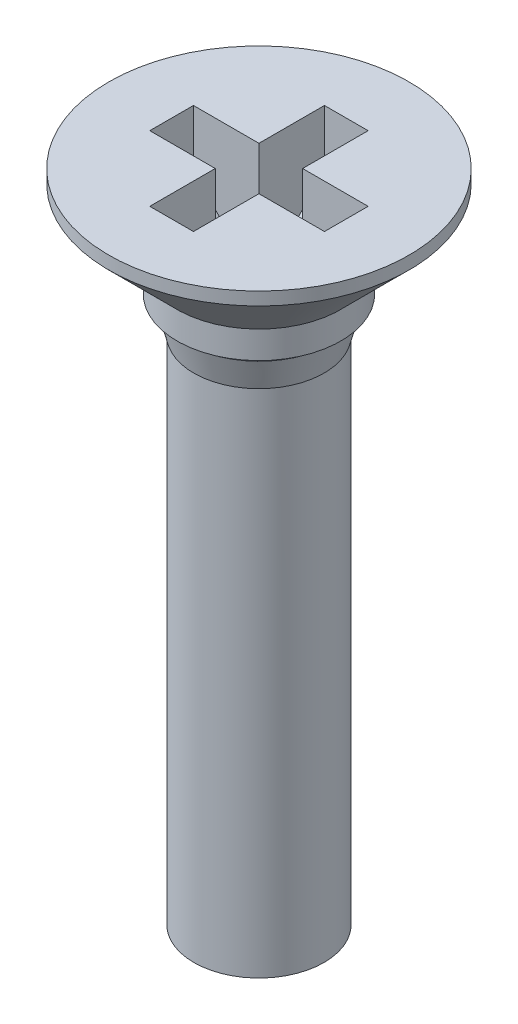
ISO-10303-21;
HEADER;
FILE_DESCRIPTION(('STEP AP214'),'2;1');
FILE_NAME('part.step','',(''),(''),'','','');
FILE_SCHEMA(('AUTOMOTIVE_DESIGN { 1 0 10303 214 1 1 1 1 }'));
ENDSEC;
DATA;
#1=APPLICATION_CONTEXT('core data for automotive mechanical design processes');
#2=APPLICATION_PROTOCOL_DEFINITION('international standard','automotive_design',2000,#1);
#3=PRODUCT_CONTEXT('',#1,'mechanical');
#4=PRODUCT('Part','Part','',(#3));
#5=PRODUCT_RELATED_PRODUCT_CATEGORY('part','',(#4));
#6=PRODUCT_DEFINITION_FORMATION('','',#4);
#7=PRODUCT_DEFINITION_CONTEXT('part definition',#1,'design');
#8=PRODUCT_DEFINITION('design','',#6,#7);
#9=PRODUCT_DEFINITION_SHAPE('','',#8);
#10=(LENGTH_UNIT() NAMED_UNIT(*) SI_UNIT(.MILLI.,.METRE.));
#11=(NAMED_UNIT(*) PLANE_ANGLE_UNIT() SI_UNIT($,.RADIAN.));
#12=(NAMED_UNIT(*) SI_UNIT($,.STERADIAN.) SOLID_ANGLE_UNIT());
#13=UNCERTAINTY_MEASURE_WITH_UNIT(LENGTH_MEASURE(1.E-05),#10,'distance_accuracy_value','');
#14=(GEOMETRIC_REPRESENTATION_CONTEXT(3) GLOBAL_UNCERTAINTY_ASSIGNED_CONTEXT((#13)) GLOBAL_UNIT_ASSIGNED_CONTEXT((#10,
#11,#12)) REPRESENTATION_CONTEXT('',''));
#15=CARTESIAN_POINT('',(0.,0.,0.));
#16=DIRECTION('',(0.,0.,1.));
#17=DIRECTION('',(1.,0.,0.));
#18=AXIS2_PLACEMENT_3D('',#15,#16,#17);
#19=CARTESIAN_POINT('',(0.,-2.65,-0.4));
#20=DIRECTION('',(0.,0.,-1.));
#21=DIRECTION('',(-1.,0.,0.));
#22=AXIS2_PLACEMENT_3D('',#19,#20,#21);
#23=PLANE('',#22);
#24=DIRECTION('',(0.,1.,0.));
#25=VECTOR('',#24,1.);
#26=CARTESIAN_POINT('',(0.4,-2.65,-0.4));
#27=LINE('',#26,#25);
#28=CARTESIAN_POINT('',(0.4,-2.1,-0.4));
#29=VERTEX_POINT('',#28);
#30=CARTESIAN_POINT('',(0.4,0.,-0.4));
#31=VERTEX_POINT('',#30);
#32=EDGE_CURVE('E215',#29,#31,#27,.T.);
#33=ORIENTED_EDGE('',*,*,#32,.F.);
#34=DIRECTION('',(1.,0.,0.));
#35=VECTOR('',#34,1.);
#36=CARTESIAN_POINT('',(-0.550000000000002,-2.1,-0.4));
#37=LINE('',#36,#35);
#38=CARTESIAN_POINT('',(0.550000000000002,-2.1,-0.4));
#39=VERTEX_POINT('',#38);
#40=EDGE_CURVE('E250',#29,#39,#37,.T.);
#41=ORIENTED_EDGE('',*,*,#40,.T.);
#42=DIRECTION('',(0.707106781186546,0.707106781186548,0.));
#43=VECTOR('',#42,1.);
#44=CARTESIAN_POINT('',(1.6,-1.05,-0.4));
#45=LINE('',#44,#43);
#46=CARTESIAN_POINT('',(1.6,-1.05,-0.4));
#47=VERTEX_POINT('',#46);
#48=EDGE_CURVE('E254',#39,#47,#45,.T.);
#49=ORIENTED_EDGE('',*,*,#48,.T.);
#50=DIRECTION('',(0.,1.,0.));
#51=VECTOR('',#50,1.);
#52=CARTESIAN_POINT('',(1.6,0.,-0.4));
#53=LINE('',#52,#51);
#54=CARTESIAN_POINT('',(1.6,0.,-0.4));
#55=VERTEX_POINT('',#54);
#56=EDGE_CURVE('E257',#47,#55,#53,.T.);
#57=ORIENTED_EDGE('',*,*,#56,.T.);
#58=DIRECTION('',(-1.,0.,0.));
#59=VECTOR('',#58,1.);
#60=CARTESIAN_POINT('',(1.6,0.,-0.4));
#61=LINE('',#60,#59);
#62=EDGE_CURVE('E261',#55,#31,#61,.T.);
#63=ORIENTED_EDGE('',*,*,#62,.T.);
#64=EDGE_LOOP('',(#33,#41,#49,#57,#63));
#65=FACE_BOUND('',#64,.T.);
#66=ADVANCED_FACE('F50',(#65),#23,.F.);
#67=CARTESIAN_POINT('',(0.,-2.65,0.4));
#68=DIRECTION('',(0.,0.,-1.));
#69=DIRECTION('',(-1.,0.,0.));
#70=AXIS2_PLACEMENT_3D('',#67,#68,#69);
#71=PLANE('',#70);
#72=DIRECTION('',(1.,0.,0.));
#73=VECTOR('',#72,1.);
#74=CARTESIAN_POINT('',(-0.550000000000002,-2.1,0.4));
#75=LINE('',#74,#73);
#76=CARTESIAN_POINT('',(0.4,-2.1,0.4));
#77=VERTEX_POINT('',#76);
#78=CARTESIAN_POINT('',(0.550000000000002,-2.1,0.4));
#79=VERTEX_POINT('',#78);
#80=EDGE_CURVE('E232',#77,#79,#75,.T.);
#81=ORIENTED_EDGE('',*,*,#80,.F.);
#82=DIRECTION('',(0.,1.,0.));
#83=VECTOR('',#82,1.);
#84=CARTESIAN_POINT('',(0.4,-2.65,0.4));
#85=LINE('',#84,#83);
#86=CARTESIAN_POINT('',(0.4,0.,0.4));
#87=VERTEX_POINT('',#86);
#88=EDGE_CURVE('E58',#77,#87,#85,.T.);
#89=ORIENTED_EDGE('',*,*,#88,.T.);
#90=DIRECTION('',(-1.,0.,0.));
#91=VECTOR('',#90,1.);
#92=CARTESIAN_POINT('',(1.6,0.,0.4));
#93=LINE('',#92,#91);
#94=CARTESIAN_POINT('',(1.6,0.,0.4));
#95=VERTEX_POINT('',#94);
#96=EDGE_CURVE('E241',#95,#87,#93,.T.);
#97=ORIENTED_EDGE('',*,*,#96,.F.);
#98=DIRECTION('',(0.,1.,0.));
#99=VECTOR('',#98,1.);
#100=CARTESIAN_POINT('',(1.6,0.,0.4));
#101=LINE('',#100,#99);
#102=CARTESIAN_POINT('',(1.6,-1.05,0.4));
#103=VERTEX_POINT('',#102);
#104=EDGE_CURVE('E238',#103,#95,#101,.T.);
#105=ORIENTED_EDGE('',*,*,#104,.F.);
#106=DIRECTION('',(0.707106781186546,0.707106781186548,0.));
#107=VECTOR('',#106,1.);
#108=CARTESIAN_POINT('',(1.6,-1.05,0.4));
#109=LINE('',#108,#107);
#110=EDGE_CURVE('E235',#79,#103,#109,.T.);
#111=ORIENTED_EDGE('',*,*,#110,.F.);
#112=EDGE_LOOP('',(#81,#89,#97,#105,#111));
#113=FACE_BOUND('',#112,.T.);
#114=ADVANCED_FACE('F304',(#113),#71,.T.);
#115=CARTESIAN_POINT('',(0.,0.,0.));
#116=DIRECTION('',(0.,-1.,0.));
#117=DIRECTION('',(1.,0.,0.));
#118=AXIS2_PLACEMENT_3D('',#115,#116,#117);
#119=PLANE('',#118);
#120=DIRECTION('',(1.,0.,0.));
#121=VECTOR('',#120,1.);
#122=CARTESIAN_POINT('',(-0.4,0.,1.6));
#123=LINE('',#122,#121);
#124=CARTESIAN_POINT('',(-0.4,0.,1.6));
#125=VERTEX_POINT('',#124);
#126=CARTESIAN_POINT('',(0.4,0.,1.6));
#127=VERTEX_POINT('',#126);
#128=EDGE_CURVE('E216',#125,#127,#123,.T.);
#129=ORIENTED_EDGE('',*,*,#128,.F.);
#130=DIRECTION('',(0.,0.,1.));
#131=VECTOR('',#130,1.);
#132=CARTESIAN_POINT('',(-0.4,0.,-1.6));
#133=LINE('',#132,#131);
#134=CARTESIAN_POINT('',(-0.4,0.,0.399999999999999));
#135=VERTEX_POINT('',#134);
#136=EDGE_CURVE('E209',#135,#125,#133,.T.);
#137=ORIENTED_EDGE('',*,*,#136,.F.);
#138=CARTESIAN_POINT('',(-1.6,0.,0.4));
#139=VERTEX_POINT('',#138);
#140=EDGE_CURVE('E240',#135,#139,#93,.T.);
#141=ORIENTED_EDGE('',*,*,#140,.T.);
#142=DIRECTION('',(0.,0.,1.));
#143=VECTOR('',#142,1.);
#144=CARTESIAN_POINT('',(-1.6,0.,-0.4));
#145=LINE('',#144,#143);
#146=CARTESIAN_POINT('',(-1.6,0.,-0.4));
#147=VERTEX_POINT('',#146);
#148=EDGE_CURVE('E271',#147,#139,#145,.T.);
#149=ORIENTED_EDGE('',*,*,#148,.F.);
#150=CARTESIAN_POINT('',(-0.4,0.,-0.4));
#151=VERTEX_POINT('',#150);
#152=EDGE_CURVE('E260',#151,#147,#61,.T.);
#153=ORIENTED_EDGE('',*,*,#152,.F.);
#154=CARTESIAN_POINT('',(-0.4,0.,-1.6));
#155=VERTEX_POINT('',#154);
#156=EDGE_CURVE('E210',#155,#151,#133,.T.);
#157=ORIENTED_EDGE('',*,*,#156,.F.);
#158=DIRECTION('',(1.,0.,0.));
#159=VECTOR('',#158,1.);
#160=CARTESIAN_POINT('',(-0.4,0.,-1.6));
#161=LINE('',#160,#159);
#162=CARTESIAN_POINT('',(0.4,0.,-1.6));
#163=VERTEX_POINT('',#162);
#164=EDGE_CURVE('E218',#155,#163,#161,.T.);
#165=ORIENTED_EDGE('',*,*,#164,.T.);
#166=DIRECTION('',(0.,0.,1.));
#167=VECTOR('',#166,1.);
#168=CARTESIAN_POINT('',(0.4,0.,-1.6));
#169=LINE('',#168,#167);
#170=EDGE_CURVE('E194',#163,#31,#169,.T.);
#171=ORIENTED_EDGE('',*,*,#170,.T.);
#172=ORIENTED_EDGE('',*,*,#62,.F.);
#173=DIRECTION('',(0.,0.,1.));
#174=VECTOR('',#173,1.);
#175=CARTESIAN_POINT('',(1.6,0.,-0.4));
#176=LINE('',#175,#174);
#177=EDGE_CURVE('E274',#55,#95,#176,.T.);
#178=ORIENTED_EDGE('',*,*,#177,.T.);
#179=ORIENTED_EDGE('',*,*,#96,.T.);
#180=EDGE_CURVE('E73',#87,#127,#169,.T.);
#181=ORIENTED_EDGE('',*,*,#180,.T.);
#182=EDGE_LOOP('',(#129,#137,#141,#149,#153,#157,#165,#171,#172,#178,#179,#181));
#183=FACE_BOUND('',#182,.T.);
#184=CARTESIAN_POINT('',(0.,0.,0.));
#185=DIRECTION('',(0.,1.,0.));
#186=DIRECTION('',(-1.,0.,0.));
#187=AXIS2_PLACEMENT_3D('',#184,#185,#186);
#188=CIRCLE('',#187,2.75);
#189=CARTESIAN_POINT('',(-2.75,0.,0.));
#190=VERTEX_POINT('',#189);
#191=EDGE_CURVE('E300',#190,#190,#188,.T.);
#192=ORIENTED_EDGE('',*,*,#191,.T.);
#193=EDGE_LOOP('',(#192));
#194=FACE_BOUND('',#193,.T.);
#195=ADVANCED_FACE('F52',(#183,#194),#119,.F.);
#196=CARTESIAN_POINT('',(0.,0.,0.));
#197=DIRECTION('',(0.,1.,0.));
#198=DIRECTION('',(-1.,0.,0.));
#199=AXIS2_PLACEMENT_3D('',#196,#197,#198);
#200=CYLINDRICAL_SURFACE('',#199,2.75);
#201=ORIENTED_EDGE('',*,*,#191,.F.);
#202=EDGE_LOOP('',(#201));
#203=FACE_BOUND('',#202,.T.);
#204=CARTESIAN_POINT('',(0.,-0.237500000000007,0.));
#205=DIRECTION('',(0.,1.,0.));
#206=DIRECTION('',(-1.,0.,0.));
#207=AXIS2_PLACEMENT_3D('',#204,#205,#206);
#208=CIRCLE('',#207,2.75);
#209=CARTESIAN_POINT('',(-2.75,-0.237500000000007,0.));
#210=VERTEX_POINT('',#209);
#211=EDGE_CURVE('E297',#210,#210,#208,.T.);
#212=ORIENTED_EDGE('',*,*,#211,.T.);
#213=EDGE_LOOP('',(#212));
#214=FACE_BOUND('',#213,.T.);
#215=ADVANCED_FACE('F409',(#203,#214),#200,.T.);
#216=CARTESIAN_POINT('',(0.,-1.4875,0.));
#217=DIRECTION('',(0.,1.,0.));
#218=DIRECTION('',(-1.,0.,0.));
#219=AXIS2_PLACEMENT_3D('',#216,#217,#218);
#220=CONICAL_SURFACE('',#219,1.5,0.78539816339745);
#221=ORIENTED_EDGE('',*,*,#211,.F.);
#222=EDGE_LOOP('',(#221));
#223=FACE_BOUND('',#222,.T.);
#224=CARTESIAN_POINT('',(0.,-1.4875,0.));
#225=DIRECTION('',(0.,1.,0.));
#226=DIRECTION('',(-1.,0.,0.));
#227=AXIS2_PLACEMENT_3D('',#224,#225,#226);
#228=CIRCLE('',#227,1.5);
#229=CARTESIAN_POINT('',(-1.5,-1.4875,0.));
#230=VERTEX_POINT('',#229);
#231=EDGE_CURVE('E294',#230,#230,#228,.T.);
#232=ORIENTED_EDGE('',*,*,#231,.T.);
#233=EDGE_LOOP('',(#232));
#234=FACE_BOUND('',#233,.T.);
#235=ADVANCED_FACE('F406',(#223,#234),#220,.T.);
#236=CARTESIAN_POINT('',(0.,0.,0.));
#237=DIRECTION('',(0.,1.,0.));
#238=DIRECTION('',(-1.,0.,0.));
#239=AXIS2_PLACEMENT_3D('',#236,#237,#238);
#240=CYLINDRICAL_SURFACE('',#239,1.5);
#241=ORIENTED_EDGE('',*,*,#231,.F.);
#242=EDGE_LOOP('',(#241));
#243=FACE_BOUND('',#242,.T.);
#244=CARTESIAN_POINT('',(0.,-1.9875,0.));
#245=DIRECTION('',(0.,1.,0.));
#246=DIRECTION('',(-1.,0.,0.));
#247=AXIS2_PLACEMENT_3D('',#244,#245,#246);
#248=CIRCLE('',#247,1.5);
#249=CARTESIAN_POINT('',(-1.5,-1.9875,0.));
#250=VERTEX_POINT('',#249);
#251=EDGE_CURVE('E291',#250,#250,#248,.T.);
#252=ORIENTED_EDGE('',*,*,#251,.T.);
#253=EDGE_LOOP('',(#252));
#254=FACE_BOUND('',#253,.T.);
#255=ADVANCED_FACE('F402',(#243,#254),#240,.T.);
#256=CARTESIAN_POINT('',(1.5,-1.9875,0.));
#257=DIRECTION('',(0.,1.,0.));
#258=DIRECTION('',(-1.,0.,0.));
#259=AXIS2_PLACEMENT_3D('',#256,#257,#258);
#260=PLANE('',#259);
#261=ORIENTED_EDGE('',*,*,#251,.F.);
#262=EDGE_LOOP('',(#261));
#263=FACE_BOUND('',#262,.T.);
#264=CARTESIAN_POINT('',(0.,-1.9875,0.));
#265=DIRECTION('',(0.,1.,0.));
#266=DIRECTION('',(-1.,0.,0.));
#267=AXIS2_PLACEMENT_3D('',#264,#265,#266);
#268=CIRCLE('',#267,1.3375);
#269=CARTESIAN_POINT('',(-1.3375,-1.9875,0.));
#270=VERTEX_POINT('',#269);
#271=EDGE_CURVE('E288',#270,#270,#268,.T.);
#272=ORIENTED_EDGE('',*,*,#271,.T.);
#273=EDGE_LOOP('',(#272));
#274=FACE_BOUND('',#273,.T.);
#275=ADVANCED_FACE('F398',(#263,#274),#260,.F.);
#276=CARTESIAN_POINT('',(0.,0.,0.));
#277=DIRECTION('',(0.,1.,0.));
#278=DIRECTION('',(-1.,0.,0.));
#279=AXIS2_PLACEMENT_3D('',#276,#277,#278);
#280=CYLINDRICAL_SURFACE('',#279,1.3375);
#281=ORIENTED_EDGE('',*,*,#271,.F.);
#282=EDGE_LOOP('',(#281));
#283=FACE_BOUND('',#282,.T.);
#284=CARTESIAN_POINT('',(0.,-2.11258468371008,0.));
#285=DIRECTION('',(0.,1.,0.));
#286=DIRECTION('',(-1.,0.,0.));
#287=AXIS2_PLACEMENT_3D('',#284,#285,#286);
#288=CIRCLE('',#287,1.3375);
#289=CARTESIAN_POINT('',(-1.3375,-2.11258468371008,0.));
#290=VERTEX_POINT('',#289);
#291=EDGE_CURVE('E285',#290,#290,#288,.T.);
#292=ORIENTED_EDGE('',*,*,#291,.T.);
#293=EDGE_LOOP('',(#292));
#294=FACE_BOUND('',#293,.T.);
#295=ADVANCED_FACE('F394',(#283,#294),#280,.T.);
#296=CARTESIAN_POINT('',(0.,-2.65,0.));
#297=DIRECTION('',(0.,1.,0.));
#298=DIRECTION('',(-1.,0.,0.));
#299=AXIS2_PLACEMENT_3D('',#296,#297,#298);
#300=CONICAL_SURFACE('',#299,1.1935,0.26179938779915);
#301=ORIENTED_EDGE('',*,*,#291,.F.);
#302=EDGE_LOOP('',(#301));
#303=FACE_BOUND('',#302,.T.);
#304=CARTESIAN_POINT('',(0.,-2.65,0.));
#305=DIRECTION('',(0.,1.,0.));
#306=DIRECTION('',(-1.,0.,0.));
#307=AXIS2_PLACEMENT_3D('',#304,#305,#306);
#308=CIRCLE('',#307,1.1935);
#309=CARTESIAN_POINT('',(-1.1935,-2.65,0.));
#310=VERTEX_POINT('',#309);
#311=EDGE_CURVE('E270',#310,#310,#308,.T.);
#312=ORIENTED_EDGE('',*,*,#311,.T.);
#313=EDGE_LOOP('',(#312));
#314=FACE_BOUND('',#313,.T.);
#315=ADVANCED_FACE('F390',(#303,#314),#300,.T.);
#316=CARTESIAN_POINT('',(0.,0.,0.));
#317=DIRECTION('',(0.,1.,0.));
#318=DIRECTION('',(-1.,0.,0.));
#319=AXIS2_PLACEMENT_3D('',#316,#317,#318);
#320=CYLINDRICAL_SURFACE('',#319,1.1935);
#321=ORIENTED_EDGE('',*,*,#311,.F.);
#322=EDGE_LOOP('',(#321));
#323=FACE_BOUND('',#322,.T.);
#324=CARTESIAN_POINT('',(0.,-12.,0.));
#325=DIRECTION('',(0.,-1.,0.));
#326=DIRECTION('',(1.,0.,0.));
#327=AXIS2_PLACEMENT_3D('',#324,#325,#326);
#328=CIRCLE('',#327,1.1935);
#329=CARTESIAN_POINT('',(1.1935,-12.,0.));
#330=VERTEX_POINT('',#329);
#331=EDGE_CURVE('E185',#330,#330,#328,.T.);
#332=ORIENTED_EDGE('',*,*,#331,.F.);
#333=EDGE_LOOP('',(#332));
#334=FACE_BOUND('',#333,.T.);
#335=ADVANCED_FACE('F387',(#323,#334),#320,.T.);
#336=CARTESIAN_POINT('',(-1.6,-1.05,-0.4));
#337=DIRECTION('',(-0.707106781186548,-0.707106781186546,0.));
#338=DIRECTION('',(0.707106781186547,-0.707106781186548,0.));
#339=AXIS2_PLACEMENT_3D('',#336,#337,#338);
#340=PLANE('',#339);
#341=DIRECTION('',(0.,0.,1.));
#342=VECTOR('',#341,1.);
#343=CARTESIAN_POINT('',(-0.550000000000002,-2.1,-0.4));
#344=LINE('',#343,#342);
#345=CARTESIAN_POINT('',(-0.550000000000002,-2.1,-0.4));
#346=VERTEX_POINT('',#345);
#347=CARTESIAN_POINT('',(-0.550000000000002,-2.1,0.4));
#348=VERTEX_POINT('',#347);
#349=EDGE_CURVE('E267',#346,#348,#344,.T.);
#350=ORIENTED_EDGE('',*,*,#349,.F.);
#351=DIRECTION('',(0.707106781186546,-0.707106781186548,0.));
#352=VECTOR('',#351,1.);
#353=CARTESIAN_POINT('',(-1.6,-1.05,-0.4));
#354=LINE('',#353,#352);
#355=CARTESIAN_POINT('',(-1.6,-1.05,-0.4));
#356=VERTEX_POINT('',#355);
#357=EDGE_CURVE('E247',#356,#346,#354,.T.);
#358=ORIENTED_EDGE('',*,*,#357,.F.);
#359=DIRECTION('',(0.,0.,1.));
#360=VECTOR('',#359,1.);
#361=CARTESIAN_POINT('',(-1.6,-1.05,-0.4));
#362=LINE('',#361,#360);
#363=CARTESIAN_POINT('',(-1.6,-1.05,0.4));
#364=VERTEX_POINT('',#363);
#365=EDGE_CURVE('E268',#356,#364,#362,.T.);
#366=ORIENTED_EDGE('',*,*,#365,.T.);
#367=DIRECTION('',(0.707106781186546,-0.707106781186548,0.));
#368=VECTOR('',#367,1.);
#369=CARTESIAN_POINT('',(-1.6,-1.05,0.4));
#370=LINE('',#369,#368);
#371=EDGE_CURVE('E229',#364,#348,#370,.T.);
#372=ORIENTED_EDGE('',*,*,#371,.T.);
#373=EDGE_LOOP('',(#350,#358,#366,#372));
#374=FACE_BOUND('',#373,.T.);
#375=ADVANCED_FACE('F341',(#374),#340,.F.);
#376=CARTESIAN_POINT('',(-1.6,0.,-0.4));
#377=DIRECTION('',(-1.,0.,0.));
#378=DIRECTION('',(0.,0.,1.));
#379=AXIS2_PLACEMENT_3D('',#376,#377,#378);
#380=PLANE('',#379);
#381=ORIENTED_EDGE('',*,*,#365,.F.);
#382=DIRECTION('',(0.,-1.,0.));
#383=VECTOR('',#382,1.);
#384=CARTESIAN_POINT('',(-1.6,0.,-0.4));
#385=LINE('',#384,#383);
#386=EDGE_CURVE('E264',#147,#356,#385,.T.);
#387=ORIENTED_EDGE('',*,*,#386,.F.);
#388=ORIENTED_EDGE('',*,*,#148,.T.);
#389=DIRECTION('',(0.,-1.,0.));
#390=VECTOR('',#389,1.);
#391=CARTESIAN_POINT('',(-1.6,0.,0.4));
#392=LINE('',#391,#390);
#393=EDGE_CURVE('E244',#139,#364,#392,.T.);
#394=ORIENTED_EDGE('',*,*,#393,.T.);
#395=EDGE_LOOP('',(#381,#387,#388,#394));
#396=FACE_BOUND('',#395,.T.);
#397=ADVANCED_FACE('F386',(#396),#380,.F.);
#398=CARTESIAN_POINT('',(1.6,0.,-0.4));
#399=DIRECTION('',(1.,0.,0.));
#400=DIRECTION('',(0.,0.,-1.));
#401=AXIS2_PLACEMENT_3D('',#398,#399,#400);
#402=PLANE('',#401);
#403=ORIENTED_EDGE('',*,*,#177,.F.);
#404=ORIENTED_EDGE('',*,*,#56,.F.);
#405=DIRECTION('',(0.,0.,1.));
#406=VECTOR('',#405,1.);
#407=CARTESIAN_POINT('',(1.6,-1.05,-0.4));
#408=LINE('',#407,#406);
#409=EDGE_CURVE('E277',#47,#103,#408,.T.);
#410=ORIENTED_EDGE('',*,*,#409,.T.);
#411=ORIENTED_EDGE('',*,*,#104,.T.);
#412=EDGE_LOOP('',(#403,#404,#410,#411));
#413=FACE_BOUND('',#412,.T.);
#414=ADVANCED_FACE('F313',(#413),#402,.F.);
#415=CARTESIAN_POINT('',(1.6,-1.05,-0.4));
#416=DIRECTION('',(0.707106781186548,-0.707106781186546,0.));
#417=DIRECTION('',(0.707106781186547,0.707106781186548,0.));
#418=AXIS2_PLACEMENT_3D('',#415,#416,#417);
#419=PLANE('',#418);
#420=ORIENTED_EDGE('',*,*,#409,.F.);
#421=ORIENTED_EDGE('',*,*,#48,.F.);
#422=DIRECTION('',(0.,0.,1.));
#423=VECTOR('',#422,1.);
#424=CARTESIAN_POINT('',(0.550000000000002,-2.1,-0.4));
#425=LINE('',#424,#423);
#426=EDGE_CURVE('E279',#39,#79,#425,.T.);
#427=ORIENTED_EDGE('',*,*,#426,.T.);
#428=ORIENTED_EDGE('',*,*,#110,.T.);
#429=EDGE_LOOP('',(#420,#421,#427,#428));
#430=FACE_BOUND('',#429,.T.);
#431=ADVANCED_FACE('F319',(#430),#419,.F.);
#432=CARTESIAN_POINT('',(-0.550000000000002,-2.1,-0.4));
#433=DIRECTION('',(0.,-1.,0.));
#434=DIRECTION('',(0.,0.,-1.));
#435=AXIS2_PLACEMENT_3D('',#432,#433,#434);
#436=PLANE('',#435);
#437=CARTESIAN_POINT('',(-0.4,-2.1,0.4));
#438=VERTEX_POINT('',#437);
#439=EDGE_CURVE('E233',#348,#438,#75,.T.);
#440=ORIENTED_EDGE('',*,*,#439,.T.);
#441=DIRECTION('',(0.,0.,-1.));
#442=VECTOR('',#441,1.);
#443=CARTESIAN_POINT('',(-0.4,-2.1,0.550000000000002));
#444=LINE('',#443,#442);
#445=CARTESIAN_POINT('',(-0.4,-2.1,0.550000000000002));
#446=VERTEX_POINT('',#445);
#447=EDGE_CURVE('E169',#446,#438,#444,.T.);
#448=ORIENTED_EDGE('',*,*,#447,.F.);
#449=DIRECTION('',(1.,0.,0.));
#450=VECTOR('',#449,1.);
#451=CARTESIAN_POINT('',(-0.4,-2.1,0.550000000000002));
#452=LINE('',#451,#450);
#453=CARTESIAN_POINT('',(0.4,-2.1,0.550000000000002));
#454=VERTEX_POINT('',#453);
#455=EDGE_CURVE('E163',#446,#454,#452,.T.);
#456=ORIENTED_EDGE('',*,*,#455,.T.);
#457=DIRECTION('',(0.,0.,-1.));
#458=VECTOR('',#457,1.);
#459=CARTESIAN_POINT('',(0.4,-2.1,0.550000000000002));
#460=LINE('',#459,#458);
#461=EDGE_CURVE('E167',#454,#77,#460,.T.);
#462=ORIENTED_EDGE('',*,*,#461,.T.);
#463=ORIENTED_EDGE('',*,*,#80,.T.);
#464=ORIENTED_EDGE('',*,*,#426,.F.);
#465=ORIENTED_EDGE('',*,*,#40,.F.);
#466=CARTESIAN_POINT('',(0.4,-2.1,-0.550000000000002));
#467=VERTEX_POINT('',#466);
#468=EDGE_CURVE('E65',#29,#467,#460,.T.);
#469=ORIENTED_EDGE('',*,*,#468,.T.);
#470=DIRECTION('',(1.,0.,0.));
#471=VECTOR('',#470,1.);
#472=CARTESIAN_POINT('',(-0.4,-2.1,-0.550000000000002));
#473=LINE('',#472,#471);
#474=CARTESIAN_POINT('',(-0.4,-2.1,-0.550000000000002));
#475=VERTEX_POINT('',#474);
#476=EDGE_CURVE('E174',#475,#467,#473,.T.);
#477=ORIENTED_EDGE('',*,*,#476,.F.);
#478=CARTESIAN_POINT('',(-0.4,-2.1,-0.4));
#479=VERTEX_POINT('',#478);
#480=EDGE_CURVE('E201',#479,#475,#444,.T.);
#481=ORIENTED_EDGE('',*,*,#480,.F.);
#482=EDGE_CURVE('E251',#346,#479,#37,.T.);
#483=ORIENTED_EDGE('',*,*,#482,.F.);
#484=ORIENTED_EDGE('',*,*,#349,.T.);
#485=EDGE_LOOP('',(#440,#448,#456,#462,#463,#464,#465,#469,#477,#481,#483,#484));
#486=FACE_BOUND('',#485,.T.);
#487=ADVANCED_FACE('F166',(#486),#436,.F.);
#488=ORIENTED_EDGE('',*,*,#482,.T.);
#489=DIRECTION('',(0.,1.,0.));
#490=VECTOR('',#489,1.);
#491=CARTESIAN_POINT('',(-0.4,-2.65,-0.4));
#492=LINE('',#491,#490);
#493=EDGE_CURVE('E226',#479,#151,#492,.T.);
#494=ORIENTED_EDGE('',*,*,#493,.T.);
#495=ORIENTED_EDGE('',*,*,#152,.T.);
#496=ORIENTED_EDGE('',*,*,#386,.T.);
#497=ORIENTED_EDGE('',*,*,#357,.T.);
#498=EDGE_LOOP('',(#488,#494,#495,#496,#497));
#499=FACE_BOUND('',#498,.T.);
#500=ADVANCED_FACE('F336',(#499),#23,.F.);
#501=DIRECTION('',(0.,1.,0.));
#502=VECTOR('',#501,1.);
#503=CARTESIAN_POINT('',(-0.4,-2.65,0.4));
#504=LINE('',#503,#502);
#505=EDGE_CURVE('E13',#438,#135,#504,.T.);
#506=ORIENTED_EDGE('',*,*,#505,.F.);
#507=ORIENTED_EDGE('',*,*,#439,.F.);
#508=ORIENTED_EDGE('',*,*,#371,.F.);
#509=ORIENTED_EDGE('',*,*,#393,.F.);
#510=ORIENTED_EDGE('',*,*,#140,.F.);
#511=EDGE_LOOP('',(#506,#507,#508,#509,#510));
#512=FACE_BOUND('',#511,.T.);
#513=ADVANCED_FACE('F346',(#512),#71,.T.);
#514=CARTESIAN_POINT('',(-0.4,-1.05,1.6));
#515=DIRECTION('',(0.,-0.707106781186546,0.707106781186548));
#516=DIRECTION('',(0.,-0.707106781186548,-0.707106781186547));
#517=AXIS2_PLACEMENT_3D('',#514,#515,#516);
#518=PLANE('',#517);
#519=ORIENTED_EDGE('',*,*,#455,.F.);
#520=DIRECTION('',(0.,-0.707106781186548,-0.707106781186546));
#521=VECTOR('',#520,1.);
#522=CARTESIAN_POINT('',(-0.4,-1.05,1.6));
#523=LINE('',#522,#521);
#524=CARTESIAN_POINT('',(-0.4,-1.05,1.6));
#525=VERTEX_POINT('',#524);
#526=EDGE_CURVE('E199',#525,#446,#523,.T.);
#527=ORIENTED_EDGE('',*,*,#526,.F.);
#528=DIRECTION('',(1.,0.,0.));
#529=VECTOR('',#528,1.);
#530=CARTESIAN_POINT('',(-0.4,-1.05,1.6));
#531=LINE('',#530,#529);
#532=CARTESIAN_POINT('',(0.4,-1.05,1.6));
#533=VERTEX_POINT('',#532);
#534=EDGE_CURVE('E183',#525,#533,#531,.T.);
#535=ORIENTED_EDGE('',*,*,#534,.T.);
#536=DIRECTION('',(0.,-0.707106781186548,-0.707106781186546));
#537=VECTOR('',#536,1.);
#538=CARTESIAN_POINT('',(0.4,-1.05,1.6));
#539=LINE('',#538,#537);
#540=EDGE_CURVE('E179',#533,#454,#539,.T.);
#541=ORIENTED_EDGE('',*,*,#540,.T.);
#542=EDGE_LOOP('',(#519,#527,#535,#541));
#543=FACE_BOUND('',#542,.T.);
#544=ADVANCED_FACE('F182',(#543),#518,.F.);
#545=CARTESIAN_POINT('',(-0.4,-2.65,0.));
#546=DIRECTION('',(-1.,0.,0.));
#547=DIRECTION('',(0.,0.,1.));
#548=AXIS2_PLACEMENT_3D('',#545,#546,#547);
#549=PLANE('',#548);
#550=ORIENTED_EDGE('',*,*,#505,.T.);
#551=ORIENTED_EDGE('',*,*,#136,.T.);
#552=DIRECTION('',(0.,-1.,0.));
#553=VECTOR('',#552,1.);
#554=CARTESIAN_POINT('',(-0.4,0.,1.6));
#555=LINE('',#554,#553);
#556=EDGE_CURVE('E175',#125,#525,#555,.T.);
#557=ORIENTED_EDGE('',*,*,#556,.T.);
#558=ORIENTED_EDGE('',*,*,#526,.T.);
#559=ORIENTED_EDGE('',*,*,#447,.T.);
#560=EDGE_LOOP('',(#550,#551,#557,#558,#559));
#561=FACE_BOUND('',#560,.T.);
#562=ADVANCED_FACE('F351',(#561),#549,.F.);
#563=CARTESIAN_POINT('',(0.4,-2.65,0.));
#564=DIRECTION('',(-1.,0.,0.));
#565=DIRECTION('',(0.,0.,1.));
#566=AXIS2_PLACEMENT_3D('',#563,#564,#565);
#567=PLANE('',#566);
#568=ORIENTED_EDGE('',*,*,#461,.F.);
#569=ORIENTED_EDGE('',*,*,#540,.F.);
#570=DIRECTION('',(0.,-1.,0.));
#571=VECTOR('',#570,1.);
#572=CARTESIAN_POINT('',(0.4,0.,1.6));
#573=LINE('',#572,#571);
#574=EDGE_CURVE('E197',#127,#533,#573,.T.);
#575=ORIENTED_EDGE('',*,*,#574,.F.);
#576=ORIENTED_EDGE('',*,*,#180,.F.);
#577=ORIENTED_EDGE('',*,*,#88,.F.);
#578=EDGE_LOOP('',(#568,#569,#575,#576,#577));
#579=FACE_BOUND('',#578,.T.);
#580=ADVANCED_FACE('F178',(#579),#567,.T.);
#581=CARTESIAN_POINT('',(-0.4,0.,1.6));
#582=DIRECTION('',(0.,0.,1.));
#583=DIRECTION('',(1.,0.,0.));
#584=AXIS2_PLACEMENT_3D('',#581,#582,#583);
#585=PLANE('',#584);
#586=ORIENTED_EDGE('',*,*,#534,.F.);
#587=ORIENTED_EDGE('',*,*,#556,.F.);
#588=ORIENTED_EDGE('',*,*,#128,.T.);
#589=ORIENTED_EDGE('',*,*,#574,.T.);
#590=EDGE_LOOP('',(#586,#587,#588,#589));
#591=FACE_BOUND('',#590,.T.);
#592=ADVANCED_FACE('F355',(#591),#585,.F.);
#593=ORIENTED_EDGE('',*,*,#480,.T.);
#594=DIRECTION('',(0.,0.707106781186548,-0.707106781186546));
#595=VECTOR('',#594,1.);
#596=CARTESIAN_POINT('',(-0.4,-1.05,-1.6));
#597=LINE('',#596,#595);
#598=CARTESIAN_POINT('',(-0.4,-1.05,-1.6));
#599=VERTEX_POINT('',#598);
#600=EDGE_CURVE('E203',#475,#599,#597,.T.);
#601=ORIENTED_EDGE('',*,*,#600,.T.);
#602=DIRECTION('',(0.,1.,0.));
#603=VECTOR('',#602,1.);
#604=CARTESIAN_POINT('',(-0.4,0.,-1.6));
#605=LINE('',#604,#603);
#606=EDGE_CURVE('E206',#599,#155,#605,.T.);
#607=ORIENTED_EDGE('',*,*,#606,.T.);
#608=ORIENTED_EDGE('',*,*,#156,.T.);
#609=ORIENTED_EDGE('',*,*,#493,.F.);
#610=EDGE_LOOP('',(#593,#601,#607,#608,#609));
#611=FACE_BOUND('',#610,.T.);
#612=ADVANCED_FACE('F333',(#611),#549,.F.);
#613=ORIENTED_EDGE('',*,*,#32,.T.);
#614=ORIENTED_EDGE('',*,*,#170,.F.);
#615=DIRECTION('',(0.,1.,0.));
#616=VECTOR('',#615,1.);
#617=CARTESIAN_POINT('',(0.4,0.,-1.6));
#618=LINE('',#617,#616);
#619=CARTESIAN_POINT('',(0.4,-1.05,-1.6));
#620=VERTEX_POINT('',#619);
#621=EDGE_CURVE('E192',#620,#163,#618,.T.);
#622=ORIENTED_EDGE('',*,*,#621,.F.);
#623=DIRECTION('',(0.,0.707106781186548,-0.707106781186546));
#624=VECTOR('',#623,1.);
#625=CARTESIAN_POINT('',(0.4,-1.05,-1.6));
#626=LINE('',#625,#624);
#627=EDGE_CURVE('E180',#467,#620,#626,.T.);
#628=ORIENTED_EDGE('',*,*,#627,.F.);
#629=ORIENTED_EDGE('',*,*,#468,.F.);
#630=EDGE_LOOP('',(#613,#614,#622,#628,#629));
#631=FACE_BOUND('',#630,.T.);
#632=ADVANCED_FACE('F326',(#631),#567,.T.);
#633=CARTESIAN_POINT('',(-0.4,0.,-1.6));
#634=DIRECTION('',(0.,0.,-1.));
#635=DIRECTION('',(-1.,0.,0.));
#636=AXIS2_PLACEMENT_3D('',#633,#634,#635);
#637=PLANE('',#636);
#638=ORIENTED_EDGE('',*,*,#164,.F.);
#639=ORIENTED_EDGE('',*,*,#606,.F.);
#640=DIRECTION('',(1.,0.,0.));
#641=VECTOR('',#640,1.);
#642=CARTESIAN_POINT('',(-0.4,-1.05,-1.6));
#643=LINE('',#642,#641);
#644=EDGE_CURVE('E221',#599,#620,#643,.T.);
#645=ORIENTED_EDGE('',*,*,#644,.T.);
#646=ORIENTED_EDGE('',*,*,#621,.T.);
#647=EDGE_LOOP('',(#638,#639,#645,#646));
#648=FACE_BOUND('',#647,.T.);
#649=ADVANCED_FACE('F329',(#648),#637,.F.);
#650=CARTESIAN_POINT('',(-0.4,-1.05,-1.6));
#651=DIRECTION('',(0.,-0.707106781186546,-0.707106781186548));
#652=DIRECTION('',(0.,0.707106781186548,-0.707106781186547));
#653=AXIS2_PLACEMENT_3D('',#650,#651,#652);
#654=PLANE('',#653);
#655=ORIENTED_EDGE('',*,*,#644,.F.);
#656=ORIENTED_EDGE('',*,*,#600,.F.);
#657=ORIENTED_EDGE('',*,*,#476,.T.);
#658=ORIENTED_EDGE('',*,*,#627,.T.);
#659=EDGE_LOOP('',(#655,#656,#657,#658));
#660=FACE_BOUND('',#659,.T.);
#661=ADVANCED_FACE('F324',(#660),#654,.F.);
#662=CARTESIAN_POINT('',(0.,-12.,0.));
#663=DIRECTION('',(0.,-1.,0.));
#664=DIRECTION('',(1.,0.,0.));
#665=AXIS2_PLACEMENT_3D('',#662,#663,#664);
#666=PLANE('',#665);
#667=ORIENTED_EDGE('',*,*,#331,.T.);
#668=EDGE_LOOP('',(#667));
#669=FACE_BOUND('',#668,.T.);
#670=ADVANCED_FACE('F432',(#669),#666,.T.);
#671=CLOSED_SHELL('',(#66,#114,#195,#215,#235,#255,#275,#295,#315,#335,#375,#397,#414,#431,#487,
#500,#513,#544,#562,#580,#592,#612,#632,#649,#661,#670));
#672=MANIFOLD_SOLID_BREP('B2',#671);
#673=ADVANCED_BREP_SHAPE_REPRESENTATION('',(#18,#672),#14);
#674=SHAPE_DEFINITION_REPRESENTATION(#9,#673);
ENDSEC;
END-ISO-10303-21;
